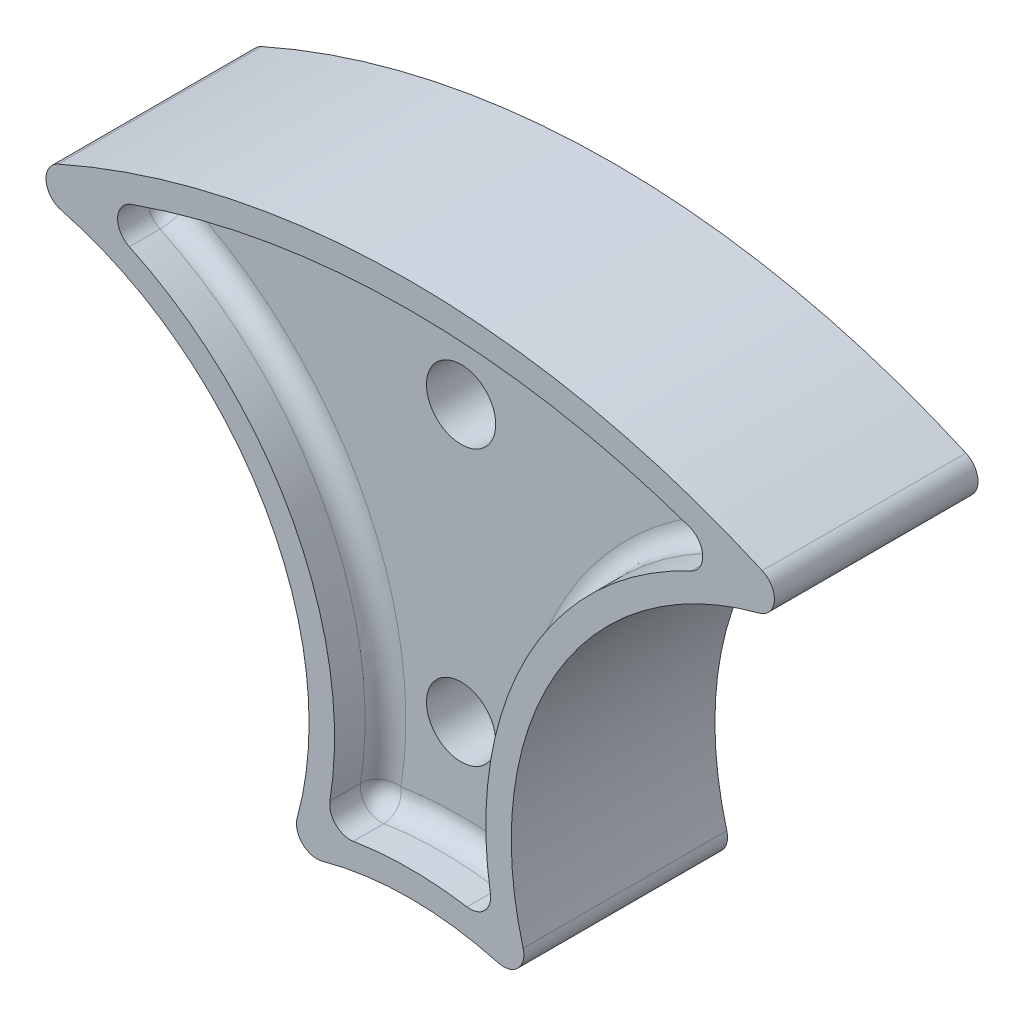
ISO-10303-21;
HEADER;
FILE_DESCRIPTION(('STEP AP214'),'2;1');
FILE_NAME('part.step','',(''),(''),'','','');
FILE_SCHEMA(('AUTOMOTIVE_DESIGN { 1 0 10303 214 1 1 1 1 }'));
ENDSEC;
DATA;
#1=APPLICATION_CONTEXT('core data for automotive mechanical design processes');
#2=APPLICATION_PROTOCOL_DEFINITION('international standard','automotive_design',2000,#1);
#3=PRODUCT_CONTEXT('',#1,'mechanical');
#4=PRODUCT('Part','Part','',(#3));
#5=PRODUCT_RELATED_PRODUCT_CATEGORY('part','',(#4));
#6=PRODUCT_DEFINITION_FORMATION('','',#4);
#7=PRODUCT_DEFINITION_CONTEXT('part definition',#1,'design');
#8=PRODUCT_DEFINITION('design','',#6,#7);
#9=PRODUCT_DEFINITION_SHAPE('','',#8);
#10=(LENGTH_UNIT() NAMED_UNIT(*) SI_UNIT(.MILLI.,.METRE.));
#11=(NAMED_UNIT(*) PLANE_ANGLE_UNIT() SI_UNIT($,.RADIAN.));
#12=(NAMED_UNIT(*) SI_UNIT($,.STERADIAN.) SOLID_ANGLE_UNIT());
#13=UNCERTAINTY_MEASURE_WITH_UNIT(LENGTH_MEASURE(1.E-05),#10,'distance_accuracy_value','');
#14=(GEOMETRIC_REPRESENTATION_CONTEXT(3) GLOBAL_UNCERTAINTY_ASSIGNED_CONTEXT((#13)) GLOBAL_UNIT_ASSIGNED_CONTEXT((#10,
#11,#12)) REPRESENTATION_CONTEXT('',''));
#15=CARTESIAN_POINT('',(0.,0.,0.));
#16=DIRECTION('',(0.,0.,1.));
#17=DIRECTION('',(1.,0.,0.));
#18=AXIS2_PLACEMENT_3D('',#15,#16,#17);
#19=CARTESIAN_POINT('',(0.,0.,20.));
#20=DIRECTION('',(0.,0.,-1.));
#21=DIRECTION('',(-1.,0.,0.));
#22=AXIS2_PLACEMENT_3D('',#19,#20,#21);
#23=CYLINDRICAL_SURFACE('',#22,32.5);
#24=CARTESIAN_POINT('',(0.,0.,0.));
#25=DIRECTION('',(0.,0.,-1.));
#26=DIRECTION('',(-1.,0.,0.));
#27=AXIS2_PLACEMENT_3D('',#24,#25,#26);
#28=CIRCLE('',#27,32.5);
#29=CARTESIAN_POINT('',(-8.6350329870809,31.3318720365066,0.));
#30=VERTEX_POINT('',#29);
#31=CARTESIAN_POINT('',(8.6350329870809,31.3318720365066,0.));
#32=VERTEX_POINT('',#31);
#33=EDGE_CURVE('E213',#30,#32,#28,.T.);
#34=ORIENTED_EDGE('',*,*,#33,.T.);
#35=DIRECTION('',(0.,0.,-1.));
#36=VECTOR('',#35,1.);
#37=CARTESIAN_POINT('',(8.6350329870809,31.3318720365066,20.));
#38=LINE('',#37,#36);
#39=CARTESIAN_POINT('',(8.6350329870809,31.3318720365066,20.));
#40=VERTEX_POINT('',#39);
#41=EDGE_CURVE('E188',#32,#40,#38,.F.);
#42=ORIENTED_EDGE('',*,*,#41,.T.);
#43=CARTESIAN_POINT('',(0.,0.,20.));
#44=DIRECTION('',(0.,0.,-1.));
#45=DIRECTION('',(-1.,0.,0.));
#46=AXIS2_PLACEMENT_3D('',#43,#44,#45);
#47=CIRCLE('',#46,32.5);
#48=CARTESIAN_POINT('',(-8.6350329870809,31.3318720365066,20.));
#49=VERTEX_POINT('',#48);
#50=EDGE_CURVE('E228',#49,#40,#47,.T.);
#51=ORIENTED_EDGE('',*,*,#50,.F.);
#52=DIRECTION('',(0.,0.,-1.));
#53=VECTOR('',#52,1.);
#54=CARTESIAN_POINT('',(-8.6350329870809,31.3318720365066,20.));
#55=LINE('',#54,#53);
#56=EDGE_CURVE('E194',#49,#30,#55,.T.);
#57=ORIENTED_EDGE('',*,*,#56,.T.);
#58=EDGE_LOOP('',(#34,#42,#51,#57));
#59=FACE_BOUND('',#58,.T.);
#60=ADVANCED_FACE('F57',(#59),#23,.F.);
#61=CARTESIAN_POINT('',(42.4264068711929,42.4264068711928,20.));
#62=DIRECTION('',(0.,0.,-1.));
#63=DIRECTION('',(-1.,0.,0.));
#64=AXIS2_PLACEMENT_3D('',#61,#62,#63);
#65=CYLINDRICAL_SURFACE('',#64,32.5);
#66=CARTESIAN_POINT('',(42.4264068711929,42.4264068711928,20.));
#67=DIRECTION('',(0.,0.,-1.));
#68=DIRECTION('',(-1.,0.,0.));
#69=AXIS2_PLACEMENT_3D('',#66,#67,#68);
#70=CIRCLE('',#69,32.5);
#71=CARTESIAN_POINT('',(11.0945348346863,33.791373884112,20.));
#72=VERTEX_POINT('',#71);
#73=CARTESIAN_POINT('',(34.2673744775874,73.8855897976468,20.));
#74=VERTEX_POINT('',#73);
#75=EDGE_CURVE('E204',#72,#74,#70,.T.);
#76=ORIENTED_EDGE('',*,*,#75,.F.);
#77=DIRECTION('',(0.,0.,-1.));
#78=VECTOR('',#77,1.);
#79=CARTESIAN_POINT('',(11.0945348346863,33.791373884112,20.));
#80=LINE('',#79,#78);
#81=CARTESIAN_POINT('',(11.0945348346863,33.791373884112,0.));
#82=VERTEX_POINT('',#81);
#83=EDGE_CURVE('E187',#72,#82,#80,.T.);
#84=ORIENTED_EDGE('',*,*,#83,.T.);
#85=CARTESIAN_POINT('',(42.4264068711929,42.4264068711928,0.));
#86=DIRECTION('',(0.,0.,-1.));
#87=DIRECTION('',(-1.,0.,0.));
#88=AXIS2_PLACEMENT_3D('',#85,#86,#87);
#89=CIRCLE('',#88,32.5);
#90=CARTESIAN_POINT('',(34.2673744775874,73.8855897976468,0.));
#91=VERTEX_POINT('',#90);
#92=EDGE_CURVE('E201',#82,#91,#89,.T.);
#93=ORIENTED_EDGE('',*,*,#92,.T.);
#94=DIRECTION('',(0.,0.,-1.));
#95=VECTOR('',#94,1.);
#96=CARTESIAN_POINT('',(34.2673744775874,73.8855897976468,20.));
#97=LINE('',#96,#95);
#98=EDGE_CURVE('E207',#91,#74,#97,.F.);
#99=ORIENTED_EDGE('',*,*,#98,.T.);
#100=EDGE_LOOP('',(#76,#84,#93,#99));
#101=FACE_BOUND('',#100,.T.);
#102=ADVANCED_FACE('F200',(#101),#65,.F.);
#103=CARTESIAN_POINT('',(0.,0.,20.));
#104=DIRECTION('',(0.,0.,-1.));
#105=DIRECTION('',(-1.,0.,0.));
#106=AXIS2_PLACEMENT_3D('',#103,#104,#105);
#107=CYLINDRICAL_SURFACE('',#106,85.);
#108=CARTESIAN_POINT('',(0.,0.,0.));
#109=DIRECTION('',(0.,0.,1.));
#110=DIRECTION('',(1.,0.,0.));
#111=AXIS2_PLACEMENT_3D('',#108,#109,#110);
#112=CIRCLE('',#111,85.);
#113=CARTESIAN_POINT('',(34.5789013855134,77.6485645647809,0.));
#114=VERTEX_POINT('',#113);
#115=CARTESIAN_POINT('',(-34.5789013855134,77.6485645647809,0.));
#116=VERTEX_POINT('',#115);
#117=EDGE_CURVE('E212',#114,#116,#112,.T.);
#118=ORIENTED_EDGE('',*,*,#117,.T.);
#119=DIRECTION('',(0.,0.,-1.));
#120=VECTOR('',#119,1.);
#121=CARTESIAN_POINT('',(-34.5789013855134,77.6485645647809,20.));
#122=LINE('',#121,#120);
#123=CARTESIAN_POINT('',(-34.5789013855134,77.6485645647809,20.));
#124=VERTEX_POINT('',#123);
#125=EDGE_CURVE('E267',#116,#124,#122,.F.);
#126=ORIENTED_EDGE('',*,*,#125,.T.);
#127=CARTESIAN_POINT('',(0.,0.,20.));
#128=DIRECTION('',(0.,0.,1.));
#129=DIRECTION('',(1.,0.,0.));
#130=AXIS2_PLACEMENT_3D('',#127,#128,#129);
#131=CIRCLE('',#130,85.);
#132=CARTESIAN_POINT('',(34.5789013855134,77.6485645647809,20.));
#133=VERTEX_POINT('',#132);
#134=EDGE_CURVE('E409',#133,#124,#131,.T.);
#135=ORIENTED_EDGE('',*,*,#134,.F.);
#136=DIRECTION('',(0.,0.,-1.));
#137=VECTOR('',#136,1.);
#138=CARTESIAN_POINT('',(34.5789013855134,77.6485645647809,20.));
#139=LINE('',#138,#137);
#140=EDGE_CURVE('E263',#133,#114,#139,.T.);
#141=ORIENTED_EDGE('',*,*,#140,.T.);
#142=EDGE_LOOP('',(#118,#126,#135,#141));
#143=FACE_BOUND('',#142,.T.);
#144=ADVANCED_FACE('F434',(#143),#107,.T.);
#145=CARTESIAN_POINT('',(-42.4264068711929,42.4264068711928,20.));
#146=DIRECTION('',(0.,0.,-1.));
#147=DIRECTION('',(-1.,0.,0.));
#148=AXIS2_PLACEMENT_3D('',#145,#146,#147);
#149=CYLINDRICAL_SURFACE('',#148,32.5);
#150=CARTESIAN_POINT('',(-42.4264068711929,42.4264068711928,0.));
#151=DIRECTION('',(0.,0.,-1.));
#152=DIRECTION('',(1.,0.,0.));
#153=AXIS2_PLACEMENT_3D('',#150,#151,#152);
#154=CIRCLE('',#153,32.5);
#155=CARTESIAN_POINT('',(-34.2673744775874,73.8855897976468,0.));
#156=VERTEX_POINT('',#155);
#157=CARTESIAN_POINT('',(-11.0945348346863,33.791373884112,0.));
#158=VERTEX_POINT('',#157);
#159=EDGE_CURVE('E219',#156,#158,#154,.T.);
#160=ORIENTED_EDGE('',*,*,#159,.T.);
#161=DIRECTION('',(0.,0.,-1.));
#162=VECTOR('',#161,1.);
#163=CARTESIAN_POINT('',(-11.0945348346863,33.791373884112,20.));
#164=LINE('',#163,#162);
#165=CARTESIAN_POINT('',(-11.0945348346863,33.791373884112,20.));
#166=VERTEX_POINT('',#165);
#167=EDGE_CURVE('E260',#158,#166,#164,.F.);
#168=ORIENTED_EDGE('',*,*,#167,.T.);
#169=CARTESIAN_POINT('',(-42.4264068711929,42.4264068711928,20.));
#170=DIRECTION('',(0.,0.,-1.));
#171=DIRECTION('',(1.,0.,0.));
#172=AXIS2_PLACEMENT_3D('',#169,#170,#171);
#173=CIRCLE('',#172,32.5);
#174=CARTESIAN_POINT('',(-34.2673744775874,73.8855897976468,20.));
#175=VERTEX_POINT('',#174);
#176=EDGE_CURVE('E230',#175,#166,#173,.T.);
#177=ORIENTED_EDGE('',*,*,#176,.F.);
#178=DIRECTION('',(0.,0.,-1.));
#179=VECTOR('',#178,1.);
#180=CARTESIAN_POINT('',(-34.2673744775874,73.8855897976468,20.));
#181=LINE('',#180,#179);
#182=EDGE_CURVE('E256',#175,#156,#181,.T.);
#183=ORIENTED_EDGE('',*,*,#182,.T.);
#184=EDGE_LOOP('',(#160,#168,#177,#183));
#185=FACE_BOUND('',#184,.T.);
#186=ADVANCED_FACE('F429',(#185),#149,.F.);
#187=CARTESIAN_POINT('',(21.2132034355965,21.2132034355964,20.));
#188=DIRECTION('',(0.,0.,-1.));
#189=DIRECTION('',(-1.,0.,0.));
#190=AXIS2_PLACEMENT_3D('',#187,#188,#189);
#191=PLANE('',#190);
#192=CARTESIAN_POINT('',(0.,0.,20.));
#193=DIRECTION('',(0.,0.,1.));
#194=DIRECTION('',(1.,0.,0.));
#195=AXIS2_PLACEMENT_3D('',#192,#193,#194);
#196=CIRCLE('',#195,82.5);
#197=CARTESIAN_POINT('',(27.3948636104136,77.8188373581027,20.));
#198=VERTEX_POINT('',#197);
#199=CARTESIAN_POINT('',(-27.3948636104136,77.8188373581027,20.));
#200=VERTEX_POINT('',#199);
#201=EDGE_CURVE('E393',#198,#200,#196,.T.);
#202=ORIENTED_EDGE('',*,*,#201,.F.);
#203=CARTESIAN_POINT('',(26.7307457047066,75.9323200888153,20.));
#204=DIRECTION('',(0.,0.,-1.));
#205=DIRECTION('',(-1.,0.,0.));
#206=AXIS2_PLACEMENT_3D('',#203,#204,#205);
#207=CIRCLE('',#206,2.);
#208=CARTESIAN_POINT('',(27.579159821814,74.1211896446195,20.));
#209=VERTEX_POINT('',#208);
#210=EDGE_CURVE('E67',#198,#209,#207,.T.);
#211=ORIENTED_EDGE('',*,*,#210,.T.);
#212=CARTESIAN_POINT('',(42.4264068711929,42.4264068711928,20.));
#213=DIRECTION('',(0.,0.,-1.));
#214=DIRECTION('',(1.,0.,0.));
#215=AXIS2_PLACEMENT_3D('',#212,#213,#214);
#216=CIRCLE('',#215,35.);
#217=CARTESIAN_POINT('',(7.87422121349427,36.8455049480334,20.));
#218=VERTEX_POINT('',#217);
#219=EDGE_CURVE('E372',#218,#209,#216,.T.);
#220=ORIENTED_EDGE('',*,*,#219,.F.);
#221=CARTESIAN_POINT('',(5.89981060448292,36.52659626671,20.));
#222=DIRECTION('',(0.,0.,-1.));
#223=DIRECTION('',(-1.,0.,0.));
#224=AXIS2_PLACEMENT_3D('',#221,#222,#223);
#225=CIRCLE('',#224,2.);
#226=CARTESIAN_POINT('',(5.58090192315952,34.5521856576986,20.));
#227=VERTEX_POINT('',#226);
#228=EDGE_CURVE('E318',#218,#227,#225,.T.);
#229=ORIENTED_EDGE('',*,*,#228,.T.);
#230=CARTESIAN_POINT('',(0.,0.,20.));
#231=DIRECTION('',(0.,0.,-1.));
#232=DIRECTION('',(1.,0.,0.));
#233=AXIS2_PLACEMENT_3D('',#230,#231,#232);
#234=CIRCLE('',#233,35.);
#235=CARTESIAN_POINT('',(-5.58090192315953,34.5521856576986,20.));
#236=VERTEX_POINT('',#235);
#237=EDGE_CURVE('E221',#236,#227,#234,.T.);
#238=ORIENTED_EDGE('',*,*,#237,.F.);
#239=CARTESIAN_POINT('',(-5.89981060448293,36.52659626671,20.));
#240=DIRECTION('',(0.,0.,-1.));
#241=DIRECTION('',(-1.,0.,0.));
#242=AXIS2_PLACEMENT_3D('',#239,#240,#241);
#243=CIRCLE('',#242,2.);
#244=CARTESIAN_POINT('',(-7.87422121349428,36.8455049480334,20.));
#245=VERTEX_POINT('',#244);
#246=EDGE_CURVE('E321',#236,#245,#243,.T.);
#247=ORIENTED_EDGE('',*,*,#246,.T.);
#248=CARTESIAN_POINT('',(-42.4264068711929,42.4264068711928,20.));
#249=DIRECTION('',(0.,0.,-1.));
#250=DIRECTION('',(1.,0.,0.));
#251=AXIS2_PLACEMENT_3D('',#248,#249,#250);
#252=CIRCLE('',#251,35.);
#253=CARTESIAN_POINT('',(-27.579159821814,74.1211896446195,20.));
#254=VERTEX_POINT('',#253);
#255=EDGE_CURVE('E397',#254,#245,#252,.T.);
#256=ORIENTED_EDGE('',*,*,#255,.F.);
#257=CARTESIAN_POINT('',(-26.7307457047066,75.9323200888153,20.));
#258=DIRECTION('',(0.,0.,-1.));
#259=DIRECTION('',(-1.,0.,0.));
#260=AXIS2_PLACEMENT_3D('',#257,#258,#259);
#261=CIRCLE('',#260,2.);
#262=EDGE_CURVE('E13',#254,#200,#261,.T.);
#263=ORIENTED_EDGE('',*,*,#262,.T.);
#264=EDGE_LOOP('',(#202,#211,#220,#229,#238,#247,#256,#263));
#265=FACE_BOUND('',#264,.T.);
#266=ORIENTED_EDGE('',*,*,#50,.T.);
#267=CARTESIAN_POINT('',(9.16641963243972,33.2599872387532,20.));
#268=DIRECTION('',(0.,0.,-1.));
#269=DIRECTION('',(-1.,0.,0.));
#270=AXIS2_PLACEMENT_3D('',#267,#268,#269);
#271=CIRCLE('',#270,2.);
#272=EDGE_CURVE('E253',#40,#72,#271,.F.);
#273=ORIENTED_EDGE('',*,*,#272,.T.);
#274=ORIENTED_EDGE('',*,*,#75,.T.);
#275=CARTESIAN_POINT('',(33.7652801764425,75.8215395161978,20.));
#276=DIRECTION('',(0.,0.,-1.));
#277=DIRECTION('',(-1.,0.,0.));
#278=AXIS2_PLACEMENT_3D('',#275,#276,#277);
#279=CIRCLE('',#278,2.);
#280=EDGE_CURVE('E244',#74,#133,#279,.F.);
#281=ORIENTED_EDGE('',*,*,#280,.T.);
#282=ORIENTED_EDGE('',*,*,#134,.T.);
#283=CARTESIAN_POINT('',(-33.7652801764425,75.8215395161978,20.));
#284=DIRECTION('',(0.,0.,-1.));
#285=DIRECTION('',(-1.,0.,0.));
#286=AXIS2_PLACEMENT_3D('',#283,#284,#285);
#287=CIRCLE('',#286,2.);
#288=EDGE_CURVE('E247',#124,#175,#287,.F.);
#289=ORIENTED_EDGE('',*,*,#288,.T.);
#290=ORIENTED_EDGE('',*,*,#176,.T.);
#291=CARTESIAN_POINT('',(-9.16641963243972,33.2599872387532,20.));
#292=DIRECTION('',(0.,0.,-1.));
#293=DIRECTION('',(-1.,0.,0.));
#294=AXIS2_PLACEMENT_3D('',#291,#292,#293);
#295=CIRCLE('',#294,2.);
#296=EDGE_CURVE('E250',#166,#49,#295,.F.);
#297=ORIENTED_EDGE('',*,*,#296,.T.);
#298=EDGE_LOOP('',(#266,#273,#274,#281,#282,#289,#290,#297));
#299=FACE_BOUND('',#298,.T.);
#300=ADVANCED_FACE('F418',(#265,#299),#191,.F.);
#301=CARTESIAN_POINT('',(21.2132034355965,21.2132034355964,0.));
#302=DIRECTION('',(0.,0.,-1.));
#303=DIRECTION('',(-1.,0.,0.));
#304=AXIS2_PLACEMENT_3D('',#301,#302,#303);
#305=PLANE('',#304);
#306=CARTESIAN_POINT('',(0.,45.,0.));
#307=DIRECTION('',(0.,0.,1.));
#308=DIRECTION('',(1.,0.,0.));
#309=AXIS2_PLACEMENT_3D('',#306,#307,#308);
#310=CIRCLE('',#309,4.5);
#311=CARTESIAN_POINT('',(4.5,45.,0.));
#312=VERTEX_POINT('',#311);
#313=EDGE_CURVE('E830',#312,#312,#310,.T.);
#314=ORIENTED_EDGE('',*,*,#313,.T.);
#315=EDGE_LOOP('',(#314));
#316=FACE_BOUND('',#315,.T.);
#317=CARTESIAN_POINT('',(0.,72.,0.));
#318=DIRECTION('',(0.,0.,1.));
#319=DIRECTION('',(1.,0.,0.));
#320=AXIS2_PLACEMENT_3D('',#317,#318,#319);
#321=CIRCLE('',#320,4.5);
#322=CARTESIAN_POINT('',(4.5,72.,0.));
#323=VERTEX_POINT('',#322);
#324=EDGE_CURVE('E381',#323,#323,#321,.T.);
#325=ORIENTED_EDGE('',*,*,#324,.T.);
#326=EDGE_LOOP('',(#325));
#327=FACE_BOUND('',#326,.T.);
#328=ORIENTED_EDGE('',*,*,#92,.F.);
#329=CARTESIAN_POINT('',(9.16641963243972,33.2599872387532,0.));
#330=DIRECTION('',(0.,0.,-1.));
#331=DIRECTION('',(-1.,0.,0.));
#332=AXIS2_PLACEMENT_3D('',#329,#330,#331);
#333=CIRCLE('',#332,2.);
#334=EDGE_CURVE('E183',#82,#32,#333,.T.);
#335=ORIENTED_EDGE('',*,*,#334,.T.);
#336=ORIENTED_EDGE('',*,*,#33,.F.);
#337=CARTESIAN_POINT('',(-9.16641963243972,33.2599872387532,0.));
#338=DIRECTION('',(0.,0.,-1.));
#339=DIRECTION('',(-1.,0.,0.));
#340=AXIS2_PLACEMENT_3D('',#337,#338,#339);
#341=CIRCLE('',#340,2.);
#342=EDGE_CURVE('E195',#30,#158,#341,.T.);
#343=ORIENTED_EDGE('',*,*,#342,.T.);
#344=ORIENTED_EDGE('',*,*,#159,.F.);
#345=CARTESIAN_POINT('',(-33.7652801764425,75.8215395161978,0.));
#346=DIRECTION('',(0.,0.,-1.));
#347=DIRECTION('',(-1.,0.,0.));
#348=AXIS2_PLACEMENT_3D('',#345,#346,#347);
#349=CIRCLE('',#348,2.);
#350=EDGE_CURVE('E234',#156,#116,#349,.T.);
#351=ORIENTED_EDGE('',*,*,#350,.T.);
#352=ORIENTED_EDGE('',*,*,#117,.F.);
#353=CARTESIAN_POINT('',(33.7652801764425,75.8215395161978,0.));
#354=DIRECTION('',(0.,0.,-1.));
#355=DIRECTION('',(-1.,0.,0.));
#356=AXIS2_PLACEMENT_3D('',#353,#354,#355);
#357=CIRCLE('',#356,2.);
#358=EDGE_CURVE('E206',#114,#91,#357,.T.);
#359=ORIENTED_EDGE('',*,*,#358,.T.);
#360=EDGE_LOOP('',(#328,#335,#336,#343,#344,#351,#352,#359));
#361=FACE_BOUND('',#360,.T.);
#362=ADVANCED_FACE('F209',(#316,#327,#361),#305,.T.);
#363=CARTESIAN_POINT('',(9.16641963243972,33.2599872387532,20.));
#364=DIRECTION('',(0.,0.,-1.));
#365=DIRECTION('',(-1.,0.,0.));
#366=AXIS2_PLACEMENT_3D('',#363,#364,#365);
#367=CYLINDRICAL_SURFACE('',#366,2.);
#368=ORIENTED_EDGE('',*,*,#272,.F.);
#369=ORIENTED_EDGE('',*,*,#41,.F.);
#370=ORIENTED_EDGE('',*,*,#334,.F.);
#371=ORIENTED_EDGE('',*,*,#83,.F.);
#372=EDGE_LOOP('',(#368,#369,#370,#371));
#373=FACE_BOUND('',#372,.T.);
#374=ADVANCED_FACE('F186',(#373),#367,.T.);
#375=CARTESIAN_POINT('',(-9.16641963243972,33.2599872387532,20.));
#376=DIRECTION('',(0.,0.,-1.));
#377=DIRECTION('',(-1.,0.,0.));
#378=AXIS2_PLACEMENT_3D('',#375,#376,#377);
#379=CYLINDRICAL_SURFACE('',#378,2.);
#380=ORIENTED_EDGE('',*,*,#296,.F.);
#381=ORIENTED_EDGE('',*,*,#167,.F.);
#382=ORIENTED_EDGE('',*,*,#342,.F.);
#383=ORIENTED_EDGE('',*,*,#56,.F.);
#384=EDGE_LOOP('',(#380,#381,#382,#383));
#385=FACE_BOUND('',#384,.T.);
#386=ADVANCED_FACE('F426',(#385),#379,.T.);
#387=CARTESIAN_POINT('',(-33.7652801764425,75.8215395161978,20.));
#388=DIRECTION('',(0.,0.,1.));
#389=DIRECTION('',(1.,0.,0.));
#390=AXIS2_PLACEMENT_3D('',#387,#388,#389);
#391=CYLINDRICAL_SURFACE('',#390,2.);
#392=ORIENTED_EDGE('',*,*,#288,.F.);
#393=ORIENTED_EDGE('',*,*,#125,.F.);
#394=ORIENTED_EDGE('',*,*,#350,.F.);
#395=ORIENTED_EDGE('',*,*,#182,.F.);
#396=EDGE_LOOP('',(#392,#393,#394,#395));
#397=FACE_BOUND('',#396,.T.);
#398=ADVANCED_FACE('F431',(#397),#391,.T.);
#399=CARTESIAN_POINT('',(33.7652801764425,75.8215395161978,20.));
#400=DIRECTION('',(0.,0.,1.));
#401=DIRECTION('',(1.,0.,0.));
#402=AXIS2_PLACEMENT_3D('',#399,#400,#401);
#403=CYLINDRICAL_SURFACE('',#402,2.);
#404=ORIENTED_EDGE('',*,*,#280,.F.);
#405=ORIENTED_EDGE('',*,*,#98,.F.);
#406=ORIENTED_EDGE('',*,*,#358,.F.);
#407=ORIENTED_EDGE('',*,*,#140,.F.);
#408=EDGE_LOOP('',(#404,#405,#406,#407));
#409=FACE_BOUND('',#408,.T.);
#410=ADVANCED_FACE('F439',(#409),#403,.T.);
#411=CARTESIAN_POINT('',(42.4264068711929,42.4264068711928,15.));
#412=DIRECTION('',(0.,0.,1.));
#413=DIRECTION('',(1.,0.,0.));
#414=AXIS2_PLACEMENT_3D('',#411,#412,#413);
#415=CYLINDRICAL_SURFACE('',#414,35.);
#416=CARTESIAN_POINT('',(42.4264068711929,42.4264068711928,17.));
#417=DIRECTION('',(0.,0.,1.));
#418=DIRECTION('',(1.,0.,0.));
#419=AXIS2_PLACEMENT_3D('',#416,#417,#418);
#420=CIRCLE('',#419,35.);
#421=CARTESIAN_POINT('',(27.579159821814,74.1211896446195,17.));
#422=VERTEX_POINT('',#421);
#423=CARTESIAN_POINT('',(7.87422121349427,36.8455049480334,17.));
#424=VERTEX_POINT('',#423);
#425=EDGE_CURVE('E75',#422,#424,#420,.T.);
#426=ORIENTED_EDGE('',*,*,#425,.T.);
#427=DIRECTION('',(0.,0.,1.));
#428=VECTOR('',#427,1.);
#429=CARTESIAN_POINT('',(7.87422121349426,36.8455049480334,15.));
#430=LINE('',#429,#428);
#431=EDGE_CURVE('E315',#424,#218,#430,.T.);
#432=ORIENTED_EDGE('',*,*,#431,.T.);
#433=ORIENTED_EDGE('',*,*,#219,.T.);
#434=DIRECTION('',(0.,0.,1.));
#435=VECTOR('',#434,1.);
#436=CARTESIAN_POINT('',(27.579159821814,74.1211896446195,15.));
#437=LINE('',#436,#435);
#438=EDGE_CURVE('E80',#209,#422,#437,.F.);
#439=ORIENTED_EDGE('',*,*,#438,.T.);
#440=EDGE_LOOP('',(#426,#432,#433,#439));
#441=FACE_BOUND('',#440,.T.);
#442=ADVANCED_FACE('F441',(#441),#415,.T.);
#443=CARTESIAN_POINT('',(0.,0.,15.));
#444=DIRECTION('',(0.,0.,1.));
#445=DIRECTION('',(1.,0.,0.));
#446=AXIS2_PLACEMENT_3D('',#443,#444,#445);
#447=CYLINDRICAL_SURFACE('',#446,35.);
#448=ORIENTED_EDGE('',*,*,#237,.T.);
#449=DIRECTION('',(0.,0.,1.));
#450=VECTOR('',#449,1.);
#451=CARTESIAN_POINT('',(5.58090192315952,34.5521856576986,15.));
#452=LINE('',#451,#450);
#453=CARTESIAN_POINT('',(5.58090192315952,34.5521856576986,17.));
#454=VERTEX_POINT('',#453);
#455=EDGE_CURVE('E308',#227,#454,#452,.F.);
#456=ORIENTED_EDGE('',*,*,#455,.T.);
#457=CARTESIAN_POINT('',(0.,0.,17.));
#458=DIRECTION('',(0.,0.,1.));
#459=DIRECTION('',(1.,0.,0.));
#460=AXIS2_PLACEMENT_3D('',#457,#458,#459);
#461=CIRCLE('',#460,35.);
#462=CARTESIAN_POINT('',(-5.58090192315953,34.5521856576986,17.));
#463=VERTEX_POINT('',#462);
#464=EDGE_CURVE('E305',#454,#463,#461,.T.);
#465=ORIENTED_EDGE('',*,*,#464,.T.);
#466=DIRECTION('',(0.,0.,1.));
#467=VECTOR('',#466,1.);
#468=CARTESIAN_POINT('',(-5.58090192315953,34.5521856576986,15.));
#469=LINE('',#468,#467);
#470=EDGE_CURVE('E302',#463,#236,#469,.T.);
#471=ORIENTED_EDGE('',*,*,#470,.T.);
#472=EDGE_LOOP('',(#448,#456,#465,#471));
#473=FACE_BOUND('',#472,.T.);
#474=ADVANCED_FACE('F447',(#473),#447,.T.);
#475=CARTESIAN_POINT('',(-42.4264068711929,42.4264068711928,15.));
#476=DIRECTION('',(0.,0.,1.));
#477=DIRECTION('',(1.,0.,0.));
#478=AXIS2_PLACEMENT_3D('',#475,#476,#477);
#479=CYLINDRICAL_SURFACE('',#478,35.);
#480=ORIENTED_EDGE('',*,*,#255,.T.);
#481=DIRECTION('',(0.,0.,1.));
#482=VECTOR('',#481,1.);
#483=CARTESIAN_POINT('',(-7.87422121349427,36.8455049480334,15.));
#484=LINE('',#483,#482);
#485=CARTESIAN_POINT('',(-7.87422121349428,36.8455049480334,17.));
#486=VERTEX_POINT('',#485);
#487=EDGE_CURVE('E299',#245,#486,#484,.F.);
#488=ORIENTED_EDGE('',*,*,#487,.T.);
#489=CARTESIAN_POINT('',(-42.4264068711929,42.4264068711928,17.));
#490=DIRECTION('',(0.,0.,1.));
#491=DIRECTION('',(1.,0.,0.));
#492=AXIS2_PLACEMENT_3D('',#489,#490,#491);
#493=CIRCLE('',#492,35.);
#494=CARTESIAN_POINT('',(-27.579159821814,74.1211896446195,17.));
#495=VERTEX_POINT('',#494);
#496=EDGE_CURVE('E296',#486,#495,#493,.T.);
#497=ORIENTED_EDGE('',*,*,#496,.T.);
#498=DIRECTION('',(0.,0.,1.));
#499=VECTOR('',#498,1.);
#500=CARTESIAN_POINT('',(-27.579159821814,74.1211896446195,15.));
#501=LINE('',#500,#499);
#502=EDGE_CURVE('E293',#495,#254,#501,.T.);
#503=ORIENTED_EDGE('',*,*,#502,.T.);
#504=EDGE_LOOP('',(#480,#488,#497,#503));
#505=FACE_BOUND('',#504,.T.);
#506=ADVANCED_FACE('F493',(#505),#479,.T.);
#507=CARTESIAN_POINT('',(0.,0.,15.));
#508=DIRECTION('',(0.,0.,1.));
#509=DIRECTION('',(1.,0.,0.));
#510=AXIS2_PLACEMENT_3D('',#507,#508,#509);
#511=CYLINDRICAL_SURFACE('',#510,82.5);
#512=CARTESIAN_POINT('',(0.,0.,17.));
#513=DIRECTION('',(0.,0.,1.));
#514=DIRECTION('',(1.,0.,0.));
#515=AXIS2_PLACEMENT_3D('',#512,#513,#514);
#516=CIRCLE('',#515,82.5);
#517=CARTESIAN_POINT('',(-27.3948636104136,77.8188373581027,17.));
#518=VERTEX_POINT('',#517);
#519=CARTESIAN_POINT('',(27.3948636104136,77.8188373581027,17.));
#520=VERTEX_POINT('',#519);
#521=EDGE_CURVE('E286',#518,#520,#516,.F.);
#522=ORIENTED_EDGE('',*,*,#521,.T.);
#523=DIRECTION('',(0.,0.,1.));
#524=VECTOR('',#523,1.);
#525=CARTESIAN_POINT('',(27.3948636104136,77.8188373581027,15.));
#526=LINE('',#525,#524);
#527=EDGE_CURVE('E290',#520,#198,#526,.T.);
#528=ORIENTED_EDGE('',*,*,#527,.T.);
#529=ORIENTED_EDGE('',*,*,#201,.T.);
#530=DIRECTION('',(0.,0.,1.));
#531=VECTOR('',#530,1.);
#532=CARTESIAN_POINT('',(-27.3948636104137,77.8188373581027,15.));
#533=LINE('',#532,#531);
#534=EDGE_CURVE('E283',#200,#518,#533,.F.);
#535=ORIENTED_EDGE('',*,*,#534,.T.);
#536=EDGE_LOOP('',(#522,#528,#529,#535));
#537=FACE_BOUND('',#536,.T.);
#538=ADVANCED_FACE('F504',(#537),#511,.F.);
#539=CARTESIAN_POINT('',(21.2132034355965,21.2132034355964,15.));
#540=DIRECTION('',(0.,0.,1.));
#541=DIRECTION('',(1.,0.,0.));
#542=AXIS2_PLACEMENT_3D('',#539,#540,#541);
#543=PLANE('',#542);
#544=CARTESIAN_POINT('',(0.,45.,15.));
#545=DIRECTION('',(0.,0.,1.));
#546=DIRECTION('',(1.,0.,0.));
#547=AXIS2_PLACEMENT_3D('',#544,#545,#546);
#548=CIRCLE('',#547,3.39999999999999);
#549=CARTESIAN_POINT('',(3.39999999999999,45.,15.));
#550=VERTEX_POINT('',#549);
#551=EDGE_CURVE('E61',#550,#550,#548,.T.);
#552=ORIENTED_EDGE('',*,*,#551,.F.);
#553=EDGE_LOOP('',(#552));
#554=FACE_BOUND('',#553,.T.);
#555=CARTESIAN_POINT('',(0.,72.,15.));
#556=DIRECTION('',(0.,0.,1.));
#557=DIRECTION('',(1.,0.,0.));
#558=AXIS2_PLACEMENT_3D('',#555,#556,#557);
#559=CIRCLE('',#558,3.39999999999999);
#560=CARTESIAN_POINT('',(3.39999999999999,72.,15.));
#561=VERTEX_POINT('',#560);
#562=EDGE_CURVE('E330',#561,#561,#559,.T.);
#563=ORIENTED_EDGE('',*,*,#562,.F.);
#564=EDGE_LOOP('',(#563));
#565=FACE_BOUND('',#564,.T.);
#566=CARTESIAN_POINT('',(42.4264068711929,42.4264068711928,15.));
#567=DIRECTION('',(0.,0.,1.));
#568=DIRECTION('',(1.,0.,0.));
#569=AXIS2_PLACEMENT_3D('',#566,#567,#568);
#570=CIRCLE('',#569,37.);
#571=CARTESIAN_POINT('',(5.89981060448292,36.52659626671,15.));
#572=VERTEX_POINT('',#571);
#573=CARTESIAN_POINT('',(26.7307457047066,75.9323200888153,15.));
#574=VERTEX_POINT('',#573);
#575=EDGE_CURVE('E270',#572,#574,#570,.F.);
#576=ORIENTED_EDGE('',*,*,#575,.T.);
#577=CARTESIAN_POINT('',(0.,0.,15.));
#578=DIRECTION('',(0.,0.,1.));
#579=DIRECTION('',(1.,0.,0.));
#580=AXIS2_PLACEMENT_3D('',#577,#578,#579);
#581=CIRCLE('',#580,80.5);
#582=CARTESIAN_POINT('',(-26.7307457047066,75.9323200888153,15.));
#583=VERTEX_POINT('',#582);
#584=EDGE_CURVE('E279',#574,#583,#581,.T.);
#585=ORIENTED_EDGE('',*,*,#584,.T.);
#586=CARTESIAN_POINT('',(-42.4264068711929,42.4264068711928,15.));
#587=DIRECTION('',(0.,0.,1.));
#588=DIRECTION('',(1.,0.,0.));
#589=AXIS2_PLACEMENT_3D('',#586,#587,#588);
#590=CIRCLE('',#589,37.);
#591=CARTESIAN_POINT('',(-5.89981060448293,36.52659626671,15.));
#592=VERTEX_POINT('',#591);
#593=EDGE_CURVE('E276',#583,#592,#590,.F.);
#594=ORIENTED_EDGE('',*,*,#593,.T.);
#595=CARTESIAN_POINT('',(0.,0.,15.));
#596=DIRECTION('',(0.,0.,1.));
#597=DIRECTION('',(1.,0.,0.));
#598=AXIS2_PLACEMENT_3D('',#595,#596,#597);
#599=CIRCLE('',#598,37.);
#600=EDGE_CURVE('E273',#592,#572,#599,.F.);
#601=ORIENTED_EDGE('',*,*,#600,.T.);
#602=EDGE_LOOP('',(#576,#585,#594,#601));
#603=FACE_BOUND('',#602,.T.);
#604=ADVANCED_FACE('F515',(#554,#565,#603),#543,.T.);
#605=CARTESIAN_POINT('',(5.89981060448292,36.52659626671,15.));
#606=DIRECTION('',(0.,0.,-1.));
#607=DIRECTION('',(-1.,0.,0.));
#608=AXIS2_PLACEMENT_3D('',#605,#606,#607);
#609=CYLINDRICAL_SURFACE('',#608,2.);
#610=ORIENTED_EDGE('',*,*,#228,.F.);
#611=ORIENTED_EDGE('',*,*,#431,.F.);
#612=CARTESIAN_POINT('',(5.89981060448292,36.52659626671,17.));
#613=DIRECTION('',(0.,0.,1.));
#614=DIRECTION('',(1.,0.,0.));
#615=AXIS2_PLACEMENT_3D('',#612,#613,#614);
#616=CIRCLE('',#615,2.);
#617=EDGE_CURVE('E369',#454,#424,#616,.T.);
#618=ORIENTED_EDGE('',*,*,#617,.F.);
#619=ORIENTED_EDGE('',*,*,#455,.F.);
#620=EDGE_LOOP('',(#610,#611,#618,#619));
#621=FACE_BOUND('',#620,.T.);
#622=ADVANCED_FACE('F59',(#621),#609,.F.);
#623=CARTESIAN_POINT('',(0.,0.,17.));
#624=DIRECTION('',(0.,0.,1.));
#625=DIRECTION('',(1.,0.,0.));
#626=AXIS2_PLACEMENT_3D('',#623,#624,#625);
#627=TOROIDAL_SURFACE('',#626,37.,2.);
#628=CARTESIAN_POINT('',(-5.89981060448293,36.52659626671,17.));
#629=DIRECTION('',(0.987205304505675,0.159454340661701,0.));
#630=DIRECTION('',(-0.159454340661701,0.987205304505675,0.));
#631=AXIS2_PLACEMENT_3D('',#628,#629,#630);
#632=CIRCLE('',#631,2.);
#633=EDGE_CURVE('E361',#463,#592,#632,.T.);
#634=ORIENTED_EDGE('',*,*,#633,.F.);
#635=ORIENTED_EDGE('',*,*,#464,.F.);
#636=CARTESIAN_POINT('',(5.89981060448292,36.52659626671,17.));
#637=DIRECTION('',(-0.987205304505675,0.159454340661697,0.));
#638=DIRECTION('',(-0.159454340661697,-0.987205304505676,0.));
#639=AXIS2_PLACEMENT_3D('',#636,#637,#638);
#640=CIRCLE('',#639,2.);
#641=EDGE_CURVE('E365',#572,#454,#640,.T.);
#642=ORIENTED_EDGE('',*,*,#641,.F.);
#643=ORIENTED_EDGE('',*,*,#600,.F.);
#644=EDGE_LOOP('',(#634,#635,#642,#643));
#645=FACE_BOUND('',#644,.T.);
#646=ADVANCED_FACE('F536',(#645),#627,.F.);
#647=CARTESIAN_POINT('',(-5.89981060448293,36.52659626671,15.));
#648=DIRECTION('',(0.,0.,-1.));
#649=DIRECTION('',(-1.,0.,0.));
#650=AXIS2_PLACEMENT_3D('',#647,#648,#649);
#651=CYLINDRICAL_SURFACE('',#650,2.);
#652=ORIENTED_EDGE('',*,*,#246,.F.);
#653=ORIENTED_EDGE('',*,*,#470,.F.);
#654=CARTESIAN_POINT('',(-5.89981060448293,36.52659626671,17.));
#655=DIRECTION('',(0.,0.,1.));
#656=DIRECTION('',(1.,0.,0.));
#657=AXIS2_PLACEMENT_3D('',#654,#655,#656);
#658=CIRCLE('',#657,2.);
#659=EDGE_CURVE('E357',#486,#463,#658,.T.);
#660=ORIENTED_EDGE('',*,*,#659,.F.);
#661=ORIENTED_EDGE('',*,*,#487,.F.);
#662=EDGE_LOOP('',(#652,#653,#660,#661));
#663=FACE_BOUND('',#662,.T.);
#664=ADVANCED_FACE('F546',(#663),#651,.F.);
#665=CARTESIAN_POINT('',(5.89981060448292,36.52659626671,17.));
#666=DIRECTION('',(0.,0.,-1.));
#667=DIRECTION('',(-1.,0.,0.));
#668=AXIS2_PLACEMENT_3D('',#665,#666,#667);
#669=SPHERICAL_SURFACE('',#668,2.);
#670=ORIENTED_EDGE('',*,*,#641,.T.);
#671=ORIENTED_EDGE('',*,*,#617,.T.);
#672=CARTESIAN_POINT('',(5.89981060448292,36.52659626671,17.));
#673=DIRECTION('',(-0.159454340661697,0.987205304505676,0.));
#674=DIRECTION('',(-0.987205304505676,-0.159454340661697,0.));
#675=AXIS2_PLACEMENT_3D('',#672,#673,#674);
#676=CIRCLE('',#675,2.);
#677=EDGE_CURVE('E353',#572,#424,#676,.F.);
#678=ORIENTED_EDGE('',*,*,#677,.F.);
#679=EDGE_LOOP('',(#670,#671,#678));
#680=FACE_BOUND('',#679,.T.);
#681=ADVANCED_FACE('F556',(#680),#669,.F.);
#682=CARTESIAN_POINT('',(-5.89981060448293,36.52659626671,17.));
#683=DIRECTION('',(0.,0.,-1.));
#684=DIRECTION('',(-1.,0.,0.));
#685=AXIS2_PLACEMENT_3D('',#682,#683,#684);
#686=SPHERICAL_SURFACE('',#685,2.);
#687=ORIENTED_EDGE('',*,*,#659,.T.);
#688=ORIENTED_EDGE('',*,*,#633,.T.);
#689=CARTESIAN_POINT('',(-5.89981060448293,36.52659626671,17.));
#690=DIRECTION('',(0.159454340661693,0.987205304505676,0.));
#691=DIRECTION('',(-0.987205304505676,0.159454340661693,0.));
#692=AXIS2_PLACEMENT_3D('',#689,#690,#691);
#693=CIRCLE('',#692,2.);
#694=EDGE_CURVE('E349',#486,#592,#693,.F.);
#695=ORIENTED_EDGE('',*,*,#694,.F.);
#696=EDGE_LOOP('',(#687,#688,#695));
#697=FACE_BOUND('',#696,.T.);
#698=ADVANCED_FACE('F567',(#697),#686,.F.);
#699=CARTESIAN_POINT('',(26.7307457047066,75.9323200888153,15.));
#700=DIRECTION('',(0.,0.,1.));
#701=DIRECTION('',(1.,0.,0.));
#702=AXIS2_PLACEMENT_3D('',#699,#700,#701);
#703=CYLINDRICAL_SURFACE('',#702,2.);
#704=ORIENTED_EDGE('',*,*,#210,.F.);
#705=ORIENTED_EDGE('',*,*,#527,.F.);
#706=CARTESIAN_POINT('',(26.7307457047066,75.9323200888153,17.));
#707=DIRECTION('',(0.,0.,1.));
#708=DIRECTION('',(1.,0.,0.));
#709=AXIS2_PLACEMENT_3D('',#706,#707,#708);
#710=CIRCLE('',#709,2.);
#711=EDGE_CURVE('E345',#422,#520,#710,.T.);
#712=ORIENTED_EDGE('',*,*,#711,.F.);
#713=ORIENTED_EDGE('',*,*,#438,.F.);
#714=EDGE_LOOP('',(#704,#705,#712,#713));
#715=FACE_BOUND('',#714,.T.);
#716=ADVANCED_FACE('F578',(#715),#703,.F.);
#717=CARTESIAN_POINT('',(42.4264068711929,42.4264068711928,17.));
#718=DIRECTION('',(0.,0.,1.));
#719=DIRECTION('',(1.,0.,0.));
#720=AXIS2_PLACEMENT_3D('',#717,#718,#719);
#721=TOROIDAL_SURFACE('',#720,37.,2.);
#722=ORIENTED_EDGE('',*,*,#677,.T.);
#723=ORIENTED_EDGE('',*,*,#425,.F.);
#724=CARTESIAN_POINT('',(26.7307457047066,75.9323200888153,17.));
#725=DIRECTION('',(-0.905565222097908,-0.424207058553681,0.));
#726=DIRECTION('',(0.424207058553681,-0.905565222097908,0.));
#727=AXIS2_PLACEMENT_3D('',#724,#725,#726);
#728=CIRCLE('',#727,2.);
#729=EDGE_CURVE('E341',#574,#422,#728,.T.);
#730=ORIENTED_EDGE('',*,*,#729,.F.);
#731=ORIENTED_EDGE('',*,*,#575,.F.);
#732=EDGE_LOOP('',(#722,#723,#730,#731));
#733=FACE_BOUND('',#732,.T.);
#734=ADVANCED_FACE('F589',(#733),#721,.F.);
#735=CARTESIAN_POINT('',(-42.4264068711929,42.4264068711928,17.));
#736=DIRECTION('',(0.,0.,1.));
#737=DIRECTION('',(1.,0.,0.));
#738=AXIS2_PLACEMENT_3D('',#735,#736,#737);
#739=TOROIDAL_SURFACE('',#738,37.,2.);
#740=ORIENTED_EDGE('',*,*,#694,.T.);
#741=ORIENTED_EDGE('',*,*,#593,.F.);
#742=CARTESIAN_POINT('',(-26.7307457047066,75.9323200888153,17.));
#743=DIRECTION('',(0.905565222097907,-0.424207058553684,0.));
#744=DIRECTION('',(0.424207058553684,0.905565222097907,0.));
#745=AXIS2_PLACEMENT_3D('',#742,#743,#744);
#746=CIRCLE('',#745,2.);
#747=EDGE_CURVE('E337',#495,#583,#746,.T.);
#748=ORIENTED_EDGE('',*,*,#747,.F.);
#749=ORIENTED_EDGE('',*,*,#496,.F.);
#750=EDGE_LOOP('',(#740,#741,#748,#749));
#751=FACE_BOUND('',#750,.T.);
#752=ADVANCED_FACE('F600',(#751),#739,.F.);
#753=CARTESIAN_POINT('',(-26.7307457047066,75.9323200888153,15.));
#754=DIRECTION('',(0.,0.,1.));
#755=DIRECTION('',(1.,0.,0.));
#756=AXIS2_PLACEMENT_3D('',#753,#754,#755);
#757=CYLINDRICAL_SURFACE('',#756,2.);
#758=ORIENTED_EDGE('',*,*,#262,.F.);
#759=ORIENTED_EDGE('',*,*,#502,.F.);
#760=CARTESIAN_POINT('',(-26.7307457047066,75.9323200888153,17.));
#761=DIRECTION('',(0.,0.,1.));
#762=DIRECTION('',(1.,0.,0.));
#763=AXIS2_PLACEMENT_3D('',#760,#761,#762);
#764=CIRCLE('',#763,2.);
#765=EDGE_CURVE('E333',#518,#495,#764,.T.);
#766=ORIENTED_EDGE('',*,*,#765,.F.);
#767=ORIENTED_EDGE('',*,*,#534,.F.);
#768=EDGE_LOOP('',(#758,#759,#766,#767));
#769=FACE_BOUND('',#768,.T.);
#770=ADVANCED_FACE('F611',(#769),#757,.F.);
#771=CARTESIAN_POINT('',(26.7307457047066,75.9323200888153,17.));
#772=DIRECTION('',(0.,0.,-1.));
#773=DIRECTION('',(-1.,0.,0.));
#774=AXIS2_PLACEMENT_3D('',#771,#772,#773);
#775=SPHERICAL_SURFACE('',#774,2.);
#776=ORIENTED_EDGE('',*,*,#729,.T.);
#777=ORIENTED_EDGE('',*,*,#711,.T.);
#778=CARTESIAN_POINT('',(26.7307457047066,75.9323200888154,17.));
#779=DIRECTION('',(-0.943258634643668,0.3320589528535,0.));
#780=DIRECTION('',(-0.3320589528535,-0.943258634643668,0.));
#781=AXIS2_PLACEMENT_3D('',#778,#779,#780);
#782=CIRCLE('',#781,2.);
#783=EDGE_CURVE('E329',#574,#520,#782,.F.);
#784=ORIENTED_EDGE('',*,*,#783,.F.);
#785=EDGE_LOOP('',(#776,#777,#784));
#786=FACE_BOUND('',#785,.T.);
#787=ADVANCED_FACE('F622',(#786),#775,.F.);
#788=CARTESIAN_POINT('',(-26.7307457047067,75.9323200888153,17.));
#789=DIRECTION('',(0.,0.,-1.));
#790=DIRECTION('',(-1.,0.,0.));
#791=AXIS2_PLACEMENT_3D('',#788,#789,#790);
#792=SPHERICAL_SURFACE('',#791,2.);
#793=ORIENTED_EDGE('',*,*,#765,.T.);
#794=ORIENTED_EDGE('',*,*,#747,.T.);
#795=CARTESIAN_POINT('',(-26.7307457047066,75.9323200888153,17.));
#796=DIRECTION('',(0.943258634643668,0.332058952853501,0.));
#797=DIRECTION('',(-0.332058952853501,0.943258634643668,0.));
#798=AXIS2_PLACEMENT_3D('',#795,#796,#797);
#799=CIRCLE('',#798,2.);
#800=EDGE_CURVE('E326',#518,#583,#799,.F.);
#801=ORIENTED_EDGE('',*,*,#800,.F.);
#802=EDGE_LOOP('',(#793,#794,#801));
#803=FACE_BOUND('',#802,.T.);
#804=ADVANCED_FACE('F633',(#803),#792,.F.);
#805=CARTESIAN_POINT('',(0.,0.,17.));
#806=DIRECTION('',(0.,0.,1.));
#807=DIRECTION('',(1.,0.,0.));
#808=AXIS2_PLACEMENT_3D('',#805,#806,#807);
#809=TOROIDAL_SURFACE('',#808,80.5,2.);
#810=ORIENTED_EDGE('',*,*,#783,.T.);
#811=ORIENTED_EDGE('',*,*,#521,.F.);
#812=ORIENTED_EDGE('',*,*,#800,.T.);
#813=ORIENTED_EDGE('',*,*,#584,.F.);
#814=EDGE_LOOP('',(#810,#811,#812,#813));
#815=FACE_BOUND('',#814,.T.);
#816=ADVANCED_FACE('F644',(#815),#809,.F.);
#817=CARTESIAN_POINT('',(0.,72.,1.10000000000001));
#818=DIRECTION('',(0.,0.,-1.));
#819=DIRECTION('',(-1.,0.,0.));
#820=AXIS2_PLACEMENT_3D('',#817,#818,#819);
#821=CONICAL_SURFACE('',#820,3.4,0.785398163397445);
#822=ORIENTED_EDGE('',*,*,#324,.F.);
#823=EDGE_LOOP('',(#822));
#824=FACE_BOUND('',#823,.T.);
#825=CARTESIAN_POINT('',(0.,72.,1.10000000000001));
#826=DIRECTION('',(0.,0.,1.));
#827=DIRECTION('',(1.,0.,0.));
#828=AXIS2_PLACEMENT_3D('',#825,#826,#827);
#829=CIRCLE('',#828,3.4);
#830=CARTESIAN_POINT('',(3.4,72.,1.10000000000001));
#831=VERTEX_POINT('',#830);
#832=EDGE_CURVE('E375',#831,#831,#829,.T.);
#833=ORIENTED_EDGE('',*,*,#832,.T.);
#834=EDGE_LOOP('',(#833));
#835=FACE_BOUND('',#834,.T.);
#836=ADVANCED_FACE('F655',(#824,#835),#821,.F.);
#837=CARTESIAN_POINT('',(0.,72.,20.));
#838=DIRECTION('',(0.,0.,1.));
#839=DIRECTION('',(1.,0.,0.));
#840=AXIS2_PLACEMENT_3D('',#837,#838,#839);
#841=CYLINDRICAL_SURFACE('',#840,3.39999999999999);
#842=ORIENTED_EDGE('',*,*,#562,.T.);
#843=EDGE_LOOP('',(#842));
#844=FACE_BOUND('',#843,.T.);
#845=ORIENTED_EDGE('',*,*,#832,.F.);
#846=EDGE_LOOP('',(#845));
#847=FACE_BOUND('',#846,.T.);
#848=ADVANCED_FACE('F665',(#844,#847),#841,.F.);
#849=CARTESIAN_POINT('',(0.,45.,1.10000000000001));
#850=DIRECTION('',(0.,0.,-1.));
#851=DIRECTION('',(-1.,0.,0.));
#852=AXIS2_PLACEMENT_3D('',#849,#850,#851);
#853=CONICAL_SURFACE('',#852,3.4,0.785398163397445);
#854=ORIENTED_EDGE('',*,*,#313,.F.);
#855=EDGE_LOOP('',(#854));
#856=FACE_BOUND('',#855,.T.);
#857=CARTESIAN_POINT('',(0.,45.,1.10000000000001));
#858=DIRECTION('',(0.,0.,1.));
#859=DIRECTION('',(1.,0.,0.));
#860=AXIS2_PLACEMENT_3D('',#857,#858,#859);
#861=CIRCLE('',#860,3.4);
#862=CARTESIAN_POINT('',(3.4,45.,1.10000000000001));
#863=VERTEX_POINT('',#862);
#864=EDGE_CURVE('E833',#863,#863,#861,.T.);
#865=ORIENTED_EDGE('',*,*,#864,.T.);
#866=EDGE_LOOP('',(#865));
#867=FACE_BOUND('',#866,.T.);
#868=ADVANCED_FACE('F677',(#856,#867),#853,.F.);
#869=CARTESIAN_POINT('',(0.,45.,20.));
#870=DIRECTION('',(0.,0.,1.));
#871=DIRECTION('',(1.,0.,0.));
#872=AXIS2_PLACEMENT_3D('',#869,#870,#871);
#873=CYLINDRICAL_SURFACE('',#872,3.39999999999999);
#874=ORIENTED_EDGE('',*,*,#551,.T.);
#875=EDGE_LOOP('',(#874));
#876=FACE_BOUND('',#875,.T.);
#877=ORIENTED_EDGE('',*,*,#864,.F.);
#878=EDGE_LOOP('',(#877));
#879=FACE_BOUND('',#878,.T.);
#880=ADVANCED_FACE('F686',(#876,#879),#873,.F.);
#881=CLOSED_SHELL('',(#60,#102,#144,#186,#300,#362,#374,#386,#398,#410,#442,#474,#506,#538,#604,
#622,#646,#664,#681,#698,#716,#734,#752,#770,#787,#804,#816,#836,#848,#868,#880));
#882=MANIFOLD_SOLID_BREP('B2',#881);
#883=ADVANCED_BREP_SHAPE_REPRESENTATION('',(#18,#882),#14);
#884=SHAPE_DEFINITION_REPRESENTATION(#9,#883);
ENDSEC;
END-ISO-10303-21;
